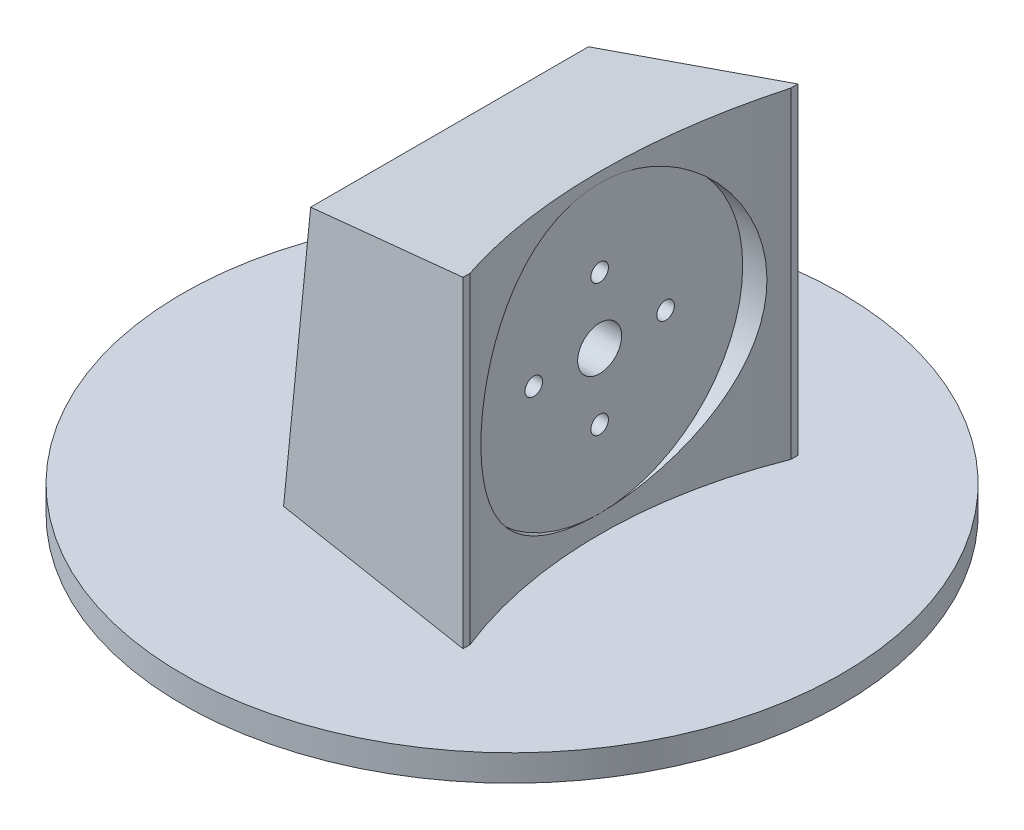
ISO-10303-21;
HEADER;
FILE_DESCRIPTION(('STEP AP214'),'2;1');
FILE_NAME('part.step','',(''),(''),'','','');
FILE_SCHEMA(('AUTOMOTIVE_DESIGN { 1 0 10303 214 1 1 1 1 }'));
ENDSEC;
DATA;
#1=APPLICATION_CONTEXT('core data for automotive mechanical design processes');
#2=APPLICATION_PROTOCOL_DEFINITION('international standard','automotive_design',2000,#1);
#3=PRODUCT_CONTEXT('',#1,'mechanical');
#4=PRODUCT('Part','Part','',(#3));
#5=PRODUCT_RELATED_PRODUCT_CATEGORY('part','',(#4));
#6=PRODUCT_DEFINITION_FORMATION('','',#4);
#7=PRODUCT_DEFINITION_CONTEXT('part definition',#1,'design');
#8=PRODUCT_DEFINITION('design','',#6,#7);
#9=PRODUCT_DEFINITION_SHAPE('','',#8);
#10=(LENGTH_UNIT() NAMED_UNIT(*) SI_UNIT(.MILLI.,.METRE.));
#11=(NAMED_UNIT(*) PLANE_ANGLE_UNIT() SI_UNIT($,.RADIAN.));
#12=(NAMED_UNIT(*) SI_UNIT($,.STERADIAN.) SOLID_ANGLE_UNIT());
#13=UNCERTAINTY_MEASURE_WITH_UNIT(LENGTH_MEASURE(1.E-05),#10,'distance_accuracy_value','');
#14=(GEOMETRIC_REPRESENTATION_CONTEXT(3) GLOBAL_UNCERTAINTY_ASSIGNED_CONTEXT((#13)) GLOBAL_UNIT_ASSIGNED_CONTEXT((#10,
#11,#12)) REPRESENTATION_CONTEXT('',''));
#15=CARTESIAN_POINT('',(0.,0.,0.));
#16=DIRECTION('',(0.,0.,1.));
#17=DIRECTION('',(1.,0.,0.));
#18=AXIS2_PLACEMENT_3D('',#15,#16,#17);
#19=CARTESIAN_POINT('',(91.660714285715,-203.2001,36.5));
#20=DIRECTION('',(0.,1.,0.));
#21=DIRECTION('',(0.,0.,1.));
#22=AXIS2_PLACEMENT_3D('',#19,#20,#21);
#23=CYLINDRICAL_SURFACE('',#22,98.6607142857149);
#24=CARTESIAN_POINT('',(-6.99999999999999,-4.,36.5));
#25=CARTESIAN_POINT('',(-7.00000006938635,-3.99999988021924,37.3885372763786));
#26=CARTESIAN_POINT('',(-6.98796916728867,-4.03641166688261,38.2770731243075));
#27=CARTESIAN_POINT('',(-6.94017665120284,-4.18170778442212,40.0475467179747));
#28=CARTESIAN_POINT('',(-6.90441509210006,-4.29059194768076,40.9294844789686));
#29=CARTESIAN_POINT('',(-6.81013401994207,-4.57981730238695,42.6804011063346));
#30=CARTESIAN_POINT('',(-6.75161231484944,-4.76016537657967,43.5493787161373));
#31=CARTESIAN_POINT('',(-6.61339151059254,-5.19067377754969,45.2681269172679));
#32=CARTESIAN_POINT('',(-6.53369229967722,-5.44083447271981,46.1178974072164));
#33=CARTESIAN_POINT('',(-6.35538689942692,-6.00831649424095,47.7910197245726));
#34=CARTESIAN_POINT('',(-6.25681293658866,-6.3255234412458,48.6144138290591));
#35=CARTESIAN_POINT('',(-6.04323760995826,-7.02477430984269,50.2309548308459));
#36=CARTESIAN_POINT('',(-5.92823628674055,-7.40681807129277,51.0241018028483));
#37=CARTESIAN_POINT('',(-5.68473032060791,-8.23291522228557,52.5753712330099));
#38=CARTESIAN_POINT('',(-5.55622378098862,-8.67697732471825,53.3334887499679));
#39=CARTESIAN_POINT('',(-5.28895986192748,-9.62396132088679,54.8101148597935));
#40=CARTESIAN_POINT('',(-5.15020223069056,-10.1268846605943,55.5286224789754));
#41=CARTESIAN_POINT('',(-4.86154233675666,-11.2045930036212,56.943276576482));
#42=CARTESIAN_POINT('',(-4.71142881699281,-11.7811085162714,57.6380620450445));
#43=CARTESIAN_POINT('',(-4.40797107281053,-12.9894358136026,58.9770008877423));
#44=CARTESIAN_POINT('',(-4.25462678882266,-13.6212486185444,59.6211533272584));
#45=CARTESIAN_POINT('',(-3.94876760978647,-14.9363935608699,60.855033965067));
#46=CARTESIAN_POINT('',(-3.79625288853813,-15.6197360797441,61.4447511429886));
#47=CARTESIAN_POINT('',(-3.49622008892867,-17.0337153626949,62.5659017618829));
#48=CARTESIAN_POINT('',(-3.34870207490673,-17.7643527354028,63.0973344525629));
#49=CARTESIAN_POINT('',(-3.05874172449786,-19.2897146308595,64.1124560176935));
#50=CARTESIAN_POINT('',(-2.9165589125235,-20.0856637999152,64.5943812501675));
#51=CARTESIAN_POINT('',(-2.64613309465236,-21.7177735571122,65.4891992851661));
#52=CARTESIAN_POINT('',(-2.51789041666039,-22.5539350904761,65.90209046397));
#53=CARTESIAN_POINT('',(-2.27942533600008,-24.2605975802209,66.6553121602869));
#54=CARTESIAN_POINT('',(-2.16919874261325,-25.1310904921396,66.995659557814));
#55=CARTESIAN_POINT('',(-1.97035650988741,-26.9003480300949,67.6008153191402));
#56=CARTESIAN_POINT('',(-1.88173992006956,-27.7991114107399,67.8656270053345));
#57=CARTESIAN_POINT('',(-1.73166110486565,-29.5879880627678,68.3096507335954));
#58=CARTESIAN_POINT('',(-1.66939715937794,-30.4774029589521,68.4914059931063));
#59=CARTESIAN_POINT('',(-1.56993894692241,-32.2696871298859,68.7801060194065));
#60=CARTESIAN_POINT('',(-1.53274416895791,-33.1725561300106,68.887052311064));
#61=CARTESIAN_POINT('',(-1.48468113630638,-34.9845408087524,69.0250244495596));
#62=CARTESIAN_POINT('',(-1.47380601462477,-35.8936547959148,69.0560700994626));
#63=CARTESIAN_POINT('',(-1.47873315448031,-37.7112058087644,69.0419722349493));
#64=CARTESIAN_POINT('',(-1.49453468320716,-38.6196428523617,68.9968308133995));
#65=CARTESIAN_POINT('',(-1.55097999230656,-40.3882309114107,68.8345556278875));
#66=CARTESIAN_POINT('',(-1.59048129533918,-41.248724601409,68.7207314381855));
#67=CARTESIAN_POINT('',(-1.69211813588085,-42.9565486195996,68.4250627083349));
#68=CARTESIAN_POINT('',(-1.7542528986177,-43.8038793973401,68.2432204965242));
#69=CARTESIAN_POINT('',(-1.89930586168877,-45.4797454825751,67.8131057979265));
#70=CARTESIAN_POINT('',(-1.98222574579713,-46.3082792614178,67.5648279291681));
#71=CARTESIAN_POINT('',(-2.1664339208442,-47.9411370546915,67.0039319210661));
#72=CARTESIAN_POINT('',(-2.26772269070303,-48.7454604372628,66.6913121041477));
#73=CARTESIAN_POINT('',(-2.48757491815505,-50.3375899400879,65.9986474572427));
#74=CARTESIAN_POINT('',(-2.60638640132822,-51.1249331894082,65.6176138364385));
#75=CARTESIAN_POINT('',(-2.79409945436385,-52.2796628163326,65.0003660731267));
#76=CARTESIAN_POINT('',(-2.85825645934174,-52.6602096754761,64.7869891144184));
#77=CARTESIAN_POINT('',(-2.98932264875029,-53.4121619858722,64.3452895408006));
#78=CARTESIAN_POINT('',(-3.05623243569593,-53.7835654071158,64.1169636474072));
#79=CARTESIAN_POINT('',(-3.26041412562294,-54.883172808634,63.4101561037206));
#80=CARTESIAN_POINT('',(-3.4011483643794,-55.5968347973896,62.9098120275704));
#81=CARTESIAN_POINT('',(-3.68814121871646,-56.9810756666464,61.8541192894888));
#82=CARTESIAN_POINT('',(-3.83440002533978,-57.6516530550876,61.2987687243221));
#83=CARTESIAN_POINT('',(-4.05889110321089,-58.638879305576,60.4121941531234));
#84=CARTESIAN_POINT('',(-4.13648834345508,-58.972552770667,60.0995884281701));
#85=CARTESIAN_POINT('',(-4.29162726248705,-59.626365005127,59.4606787664354));
#86=CARTESIAN_POINT('',(-4.36916895003063,-59.9465069256565,59.1343780545456));
#87=CARTESIAN_POINT('',(-4.60095541029194,-60.8860530859771,58.135491414433));
#88=CARTESIAN_POINT('',(-4.75437173321152,-61.4846218971867,57.4428813051275));
#89=CARTESIAN_POINT('',(-5.05473361071183,-62.6219164771072,56.008855902778));
#90=CARTESIAN_POINT('',(-5.20167850291606,-63.1606361285731,55.2674356331082));
#91=CARTESIAN_POINT('',(-5.48509843468752,-64.1744782472974,53.7403741952948));
#92=CARTESIAN_POINT('',(-5.62157354974552,-64.649601173129,52.954733346068));
#93=CARTESIAN_POINT('',(-5.88153981188521,-65.5368769484307,51.3365448851173));
#94=CARTESIAN_POINT('',(-6.00489365095648,-65.948381108045,50.5036192011035));
#95=CARTESIAN_POINT('',(-6.23359386490435,-66.6994535007599,48.8035165875243));
#96=CARTESIAN_POINT('',(-6.33894001624403,-67.0390208408913,47.9363392329431));
#97=CARTESIAN_POINT('',(-6.52854641064324,-67.6430722927355,46.1742222318911));
#98=CARTESIAN_POINT('',(-6.61281246721029,-67.9075771080408,45.2792903163174));
#99=CARTESIAN_POINT('',(-6.75780776456789,-68.3590746072722,43.4682209501035));
#100=CARTESIAN_POINT('',(-6.81853806425131,-68.5460707784017,42.5520844554403));
#101=CARTESIAN_POINT('',(-6.91260119712613,-68.8343955865342,40.7451589823643));
#102=CARTESIAN_POINT('',(-6.94699053535751,-68.9390330015753,39.8549517810904));
#103=CARTESIAN_POINT('',(-6.99158021256407,-69.0745338238442,38.0683440667751));
#104=CARTESIAN_POINT('',(-7.00178123890712,-69.1053993274747,37.1719437304524));
#105=CARTESIAN_POINT('',(-6.9977097128631,-69.0930577050398,35.3798465019674));
#106=CARTESIAN_POINT('',(-6.98344076748059,-69.0498614960666,34.4841495255966));
#107=CARTESIAN_POINT('',(-6.93083480777777,-68.8898394345348,32.7000802562324));
#108=CARTESIAN_POINT('',(-6.8924980280921,-68.7730142997763,31.8117078919178));
#109=CARTESIAN_POINT('',(-6.79423645561106,-68.4711994586813,30.0738654772518));
#110=CARTESIAN_POINT('',(-6.73495390800708,-68.288234265034,29.224006268323));
#111=CARTESIAN_POINT('',(-6.59621152878559,-67.8554534181377,27.5432045903623));
#112=CARTESIAN_POINT('',(-6.51675218269506,-67.6056393735069,26.7122616666602));
#113=CARTESIAN_POINT('',(-6.3396712304458,-67.0411999885723,25.0746158716635));
#114=CARTESIAN_POINT('',(-6.24204806162277,-66.7265690717138,24.2679150929026));
#115=CARTESIAN_POINT('',(-6.03109361619502,-66.0349741325519,22.6838553608445));
#116=CARTESIAN_POINT('',(-5.91776190224279,-65.6580083747043,21.9064972252538));
#117=CARTESIAN_POINT('',(-5.6750445034493,-64.8338283540359,20.3658675341615));
#118=CARTESIAN_POINT('',(-5.54531817081558,-64.3850431727435,19.6034869558279));
#119=CARTESIAN_POINT('',(-5.34305673005682,-63.6673403475718,18.4903516336136));
#120=CARTESIAN_POINT('',(-5.27435379946857,-63.4206711666397,18.1243607740445));
#121=CARTESIAN_POINT('',(-5.13480192892662,-62.9128062671061,17.4028907237109));
#122=CARTESIAN_POINT('',(-5.06395250727708,-62.6516072766965,17.0474139283209));
#123=CARTESIAN_POINT('',(-4.84886293631561,-61.8468729717835,15.9976058436562));
#124=CARTESIAN_POINT('',(-4.70207337295436,-61.2821718289302,15.31985268804));
#125=CARTESIAN_POINT('',(-4.4054574693996,-60.1000013569676,14.0127481170339));
#126=CARTESIAN_POINT('',(-4.25563105215844,-59.482530687768,13.3833979316167));
#127=CARTESIAN_POINT('',(-4.02817040500257,-58.5052948612115,12.465038558412));
#128=CARTESIAN_POINT('',(-3.95023063751204,-58.1632853098455,12.1570302371489));
#129=CARTESIAN_POINT('',(-3.79513329794573,-57.4665045484266,11.5557810155459));
#130=CARTESIAN_POINT('',(-3.71797554525475,-57.111736375381,11.2625366402262));
#131=CARTESIAN_POINT('',(-3.48845375478196,-56.0289003782251,10.4055146073962));
#132=CARTESIAN_POINT('',(-3.33803030963804,-55.2822548549188,9.86440460906265));
#133=CARTESIAN_POINT('',(-3.04680778471545,-53.7444961617453,8.84675158852445));
#134=CARTESIAN_POINT('',(-2.90600900850904,-52.95338159071,8.37021060242965));
#135=CARTESIAN_POINT('',(-2.63823733238804,-51.3316626872409,7.48520948496329));
#136=CARTESIAN_POINT('',(-2.51126419221074,-50.501059041411,7.07674817043365));
#137=CARTESIAN_POINT('',(-2.27537744571331,-48.8079071514655,6.33214430706681));
#138=CARTESIAN_POINT('',(-2.16642233571994,-47.9454380818967,5.99583501230236));
#139=CARTESIAN_POINT('',(-1.96972394302317,-46.1927699028265,5.39731630355124));
#140=CARTESIAN_POINT('',(-1.88198072463595,-45.3025707092543,5.13510711424168));
#141=CARTESIAN_POINT('',(-1.73067224333006,-43.501399097928,4.68740217565629));
#142=CARTESIAN_POINT('',(-1.66709810661102,-42.5904344347847,4.5018782688045));
#143=CARTESIAN_POINT('',(-1.56628042912651,-40.7545585492031,4.20931929430625));
#144=CARTESIAN_POINT('',(-1.52903559780061,-39.8296480126074,4.10228037962031));
#145=CARTESIAN_POINT('',(-1.48336211419073,-38.0201739597151,3.97121209209996));
#146=CARTESIAN_POINT('',(-1.47357600679801,-37.1359257994844,3.94327171953421));
#147=CARTESIAN_POINT('',(-1.47923210726148,-35.3681889321181,3.95945552076158));
#148=CARTESIAN_POINT('',(-1.49467342655211,-34.4847001993303,4.00357715637195));
#149=CARTESIAN_POINT('',(-1.55028672953893,-32.725081310718,4.16344260873036));
#150=CARTESIAN_POINT('',(-1.59045722021381,-31.8489507138835,4.27918210155946));
#151=CARTESIAN_POINT('',(-1.69425391713303,-30.1103489722141,4.58116716259673));
#152=CARTESIAN_POINT('',(-1.75788020320498,-29.2478778738773,4.76741297076062));
#153=CARTESIAN_POINT('',(-1.90525309709722,-27.5582447651126,5.20465815934755));
#154=CARTESIAN_POINT('',(-1.988610510916,-26.7307254841264,5.45441118401029));
#155=CARTESIAN_POINT('',(-2.17360852817507,-25.1000021292595,6.01813110690589));
#156=CARTESIAN_POINT('',(-2.27524880454255,-24.2967976206979,6.33209685641354));
#157=CARTESIAN_POINT('',(-2.49398869561496,-22.7194432592458,7.02188475019655));
#158=CARTESIAN_POINT('',(-2.61109088194527,-21.9452982671026,7.39771718671229));
#159=CARTESIAN_POINT('',(-2.85757822601426,-20.4306914423535,8.20850970436679));
#160=CARTESIAN_POINT('',(-2.98696382129011,-19.6902308109811,8.64347189195617));
#161=CARTESIAN_POINT('',(-3.26041750687362,-18.2160420205345,9.58963208190045));
#162=CARTESIAN_POINT('',(-3.40487736389312,-17.4839656361855,10.1033002029974));
#163=CARTESIAN_POINT('',(-3.6258291609834,-16.4201266890071,10.916994163656));
#164=CARTESIAN_POINT('',(-3.7001944304754,-16.0712075091097,11.1954411179281));
#165=CARTESIAN_POINT('',(-3.84987734772482,-15.3851438486486,11.7664081592043));
#166=CARTESIAN_POINT('',(-3.92519521566213,-15.0480021606263,12.0589315452788));
#167=CARTESIAN_POINT('',(-4.15181299150519,-14.0550749286328,12.9569073233005));
#168=CARTESIAN_POINT('',(-4.30378689273426,-13.4177404291299,13.5828011340082));
#169=CARTESIAN_POINT('',(-4.60548481423115,-12.1964095099643,14.8851425021411));
#170=CARTESIAN_POINT('',(-4.75520881764884,-11.6124134896028,15.5615904379545));
#171=CARTESIAN_POINT('',(-4.97795892140497,-10.7686807505849,16.6243565255697));
#172=CARTESIAN_POINT('',(-5.05324682558714,-10.4880524972123,16.9937791723638));
#173=CARTESIAN_POINT('',(-5.2016267863963,-9.94270986311723,17.7444722207686));
#174=CARTESIAN_POINT('',(-5.27471936109133,-9.67799171282775,18.1257397832416));
#175=CARTESIAN_POINT('',(-5.48997143429848,-8.90828116509444,19.2866397029895));
#176=CARTESIAN_POINT('',(-5.6281163049021,-8.42769133893212,20.0834213449));
#177=CARTESIAN_POINT('',(-5.88967186784149,-7.53576861896884,21.7168063491419));
#178=CARTESIAN_POINT('',(-6.01308584303076,-7.12442028594169,22.5534007806493));
#179=CARTESIAN_POINT('',(-6.24170141139997,-6.37423725198776,24.2609165521429));
#180=CARTESIAN_POINT('',(-6.34690403754347,-6.03539843800027,25.1318359417452));
#181=CARTESIAN_POINT('',(-6.53116694591902,-5.44879458043133,26.8561525673258));
#182=CARTESIAN_POINT('',(-6.61129294011374,-5.19724377621841,27.708149805564));
#183=CARTESIAN_POINT('',(-6.75026044407504,-4.76434305494516,29.4314976595926));
#184=CARTESIAN_POINT('',(-6.80910277770205,-4.58299042059376,30.302847524884));
#185=CARTESIAN_POINT('',(-6.90389549609838,-4.29217646529803,32.0585054030479));
#186=CARTESIAN_POINT('',(-6.9398509040999,-4.18269936891412,32.9428105288757));
#187=CARTESIAN_POINT('',(-6.98790317798278,-4.03661102309193,34.7180775607991));
#188=CARTESIAN_POINT('',(-6.9999999304244,-4.00000012010744,35.6090394985254));
#189=CARTESIAN_POINT('',(-6.99999999999999,-4.,36.5));
#190=B_SPLINE_CURVE_WITH_KNOTS('',3,(#24,#25,#26,#27,#28,#29,#30,#31,#32,#33,#34,#35,#36,#37,
#38,#39,#40,#41,#42,#43,#44,#45,#46,#47,#48,#49,#50,#51,#52,#53,#54,#55,#56,#57,#58,#59,#60,#61,
#62,#63,#64,#65,#66,#67,#68,#69,#70,#71,#72,#73,#74,#75,#76,#77,#78,#79,#80,#81,#82,#83,#84,#85,
#86,#87,#88,#89,#90,#91,#92,#93,#94,#95,#96,#97,#98,#99,#100,#101,#102,#103,#104,#105,#106,#107,
#108,#109,#110,#111,#112,#113,#114,#115,#116,#117,#118,#119,#120,#121,#122,#123,#124,#125,#126,
#127,#128,#129,#130,#131,#132,#133,#134,#135,#136,#137,#138,#139,#140,#141,#142,#143,#144,#145,
#146,#147,#148,#149,#150,#151,#152,#153,#154,#155,#156,#157,#158,#159,#160,#161,#162,#163,#164,
#165,#166,#167,#168,#169,#170,#171,#172,#173,#174,#175,#176,#177,#178,#179,#180,#181,#182,#183,
#184,#185,#186,#187,#188,#189),.UNSPECIFIED.,.T.,.F.,(4,2,2,2,2,2,2,2,2,2,2,2,2,2,2,2,2,2,2,2,2,
2,2,2,2,2,2,2,2,2,2,2,2,2,2,2,2,2,2,2,2,2,2,2,2,2,2,2,2,2,2,2,2,2,2,2,2,2,2,2,2,2,2,2,2,2,2,2,2,
2,2,2,2,2,2,2,2,2,2,2,2,2,4),(0.,2.66478598896283,5.32956581470613,7.99460234988263,
10.6596529484029,13.3201932082655,15.9807268968932,18.6416347377303,21.3026079595429,
24.0451663976942,26.7877754479947,29.5309385248892,32.2741369102067,35.0945045535153,
37.9149385241692,40.7347154975727,43.5543684255566,46.280690860044,49.0069577209325,
51.7325132017484,54.4579938124977,57.0615981230231,59.6651133172248,62.268839486814,
64.8726335514366,67.5176362580745,68.8402661937596,70.1631871763424,72.808820493765,
75.4545453826127,76.8454941067395,78.236117108444,81.0171829618584,83.7985328099009,
86.5798626015439,89.3879081969201,92.1959886472051,95.0032938240161,97.8104726832143,
100.498118282683,103.185687505454,105.872860600215,108.560007498432,111.171040179704,
113.78201003601,116.393204622405,119.004471922659,121.68359537355,123.023297222177,
124.363301974415,127.043152403427,129.7230709079,131.123144165592,132.522886333506,
135.322178224198,138.12155836682,140.920889853882,143.713680582999,146.506479779979,
149.298252594065,152.089888556787,154.740856418418,157.391730909131,160.04244536925,
162.693168850686,165.295421370138,167.897627341004,170.500266657313,173.102998714897,
175.817395404968,177.174747605651,178.532419491045,181.2475846255,183.962770084494,
185.372371144095,186.781636900762,189.599966952013,192.417667747036,195.235208667212,
197.907939635198,200.58056713447,203.252607841876,205.92466125389),.UNSPECIFIED.);
#191=CARTESIAN_POINT('',(-6.99999999999999,-69.1,36.5));
#192=VERTEX_POINT('',#191);
#193=CARTESIAN_POINT('',(-6.99999999999999,-4.,36.5));
#194=VERTEX_POINT('',#193);
#195=EDGE_CURVE('E276',#192,#194,#190,.T.);
#196=ORIENTED_EDGE('',*,*,#195,.F.);
#197=EDGE_CURVE('E357',#194,#192,#190,.T.);
#198=ORIENTED_EDGE('',*,*,#197,.F.);
#199=EDGE_LOOP('',(#196,#198));
#200=FACE_BOUND('',#199,.T.);
#201=CARTESIAN_POINT('',(91.660714285715,-73.2,36.5));
#202=DIRECTION('',(0.,-1.,0.));
#203=DIRECTION('',(0.,0.,-1.));
#204=AXIS2_PLACEMENT_3D('',#201,#202,#203);
#205=CIRCLE('',#204,98.6607142857149);
#206=CARTESIAN_POINT('',(0.,-73.2,0.));
#207=VERTEX_POINT('',#206);
#208=CARTESIAN_POINT('',(0.,-73.2,73.));
#209=VERTEX_POINT('',#208);
#210=EDGE_CURVE('E177',#207,#209,#205,.F.);
#211=ORIENTED_EDGE('',*,*,#210,.F.);
#212=DIRECTION('',(0.,1.,0.));
#213=VECTOR('',#212,1.);
#214=CARTESIAN_POINT('',(0.,-203.2001,0.));
#215=LINE('',#214,#213);
#216=CARTESIAN_POINT('',(0.,0.,0.));
#217=VERTEX_POINT('',#216);
#218=EDGE_CURVE('E183',#207,#217,#215,.T.);
#219=ORIENTED_EDGE('',*,*,#218,.T.);
#220=CARTESIAN_POINT('',(91.660714285715,22.2712628755916,36.5));
#221=DIRECTION('',(-0.236105481445946,0.971727431758093,0.));
#222=DIRECTION('',(0.971727431758093,0.236105481445946,0.));
#223=AXIS2_PLACEMENT_3D('',#220,#221,#222);
#224=ELLIPSE('',#223,101.53126387223,98.6607142857149);
#225=CARTESIAN_POINT('',(0.,0.,73.));
#226=VERTEX_POINT('',#225);
#227=EDGE_CURVE('E179',#226,#217,#224,.F.);
#228=ORIENTED_EDGE('',*,*,#227,.F.);
#229=DIRECTION('',(0.,1.,0.));
#230=VECTOR('',#229,1.);
#231=CARTESIAN_POINT('',(0.,-203.2001,73.));
#232=LINE('',#231,#230);
#233=EDGE_CURVE('E175',#209,#226,#232,.T.);
#234=ORIENTED_EDGE('',*,*,#233,.F.);
#235=EDGE_LOOP('',(#211,#219,#228,#234));
#236=FACE_BOUND('',#235,.T.);
#237=ADVANCED_FACE('F98',(#200,#236),#23,.F.);
#238=CARTESIAN_POINT('',(-63.5,-203.2,-1.59999999999998));
#239=DIRECTION('',(-0.993378927542283,0.114883881876199,0.));
#240=DIRECTION('',(0.,0.,1.));
#241=AXIS2_PLACEMENT_3D('',#238,#239,#240);
#242=PLANE('',#241);
#243=CARTESIAN_POINT('',(-44.2269931102362,-36.5499999999998,21.4999999999998));
#244=DIRECTION('',(-0.993378927542283,0.114883881876199,0.));
#245=DIRECTION('',(0.114883881876199,0.993378927542283,0.));
#246=AXIS2_PLACEMENT_3D('',#243,#244,#245);
#247=ELLIPSE('',#246,3.07032886991674,3.05);
#248=CARTESIAN_POINT('',(-43.8742618110236,-33.4999999999998,21.4999999999998));
#249=VERTEX_POINT('',#248);
#250=EDGE_CURVE('E390',#249,#249,#247,.T.);
#251=ORIENTED_EDGE('',*,*,#250,.F.);
#252=EDGE_LOOP('',(#251));
#253=FACE_BOUND('',#252,.T.);
#254=CARTESIAN_POINT('',(-45.9617372047244,-51.55,36.4999999999997));
#255=DIRECTION('',(-0.993378927542283,0.114883881876199,0.));
#256=DIRECTION('',(0.114883881876199,0.993378927542283,0.));
#257=AXIS2_PLACEMENT_3D('',#254,#255,#256);
#258=ELLIPSE('',#257,3.07032886991674,3.05);
#259=CARTESIAN_POINT('',(-45.6090059055118,-48.5,36.4999999999997));
#260=VERTEX_POINT('',#259);
#261=EDGE_CURVE('E387',#260,#260,#258,.T.);
#262=ORIENTED_EDGE('',*,*,#261,.F.);
#263=EDGE_LOOP('',(#262));
#264=FACE_BOUND('',#263,.T.);
#265=CARTESIAN_POINT('',(-44.2269931102362,-36.5500000000001,51.4999999999998));
#266=DIRECTION('',(-0.993378927542283,0.114883881876199,0.));
#267=DIRECTION('',(0.114883881876199,0.993378927542283,0.));
#268=AXIS2_PLACEMENT_3D('',#265,#266,#267);
#269=ELLIPSE('',#268,3.07032886991675,3.05000000000001);
#270=CARTESIAN_POINT('',(-43.8742618110236,-33.5,51.4999999999998));
#271=VERTEX_POINT('',#270);
#272=EDGE_CURVE('E384',#271,#271,#269,.T.);
#273=ORIENTED_EDGE('',*,*,#272,.F.);
#274=EDGE_LOOP('',(#273));
#275=FACE_BOUND('',#274,.T.);
#276=CARTESIAN_POINT('',(-42.492249015748,-21.55,36.5));
#277=DIRECTION('',(-0.993378927542283,0.114883881876199,0.));
#278=DIRECTION('',(0.114883881876199,0.993378927542283,0.));
#279=AXIS2_PLACEMENT_3D('',#276,#277,#278);
#280=ELLIPSE('',#279,3.07032886991674,3.05);
#281=CARTESIAN_POINT('',(-42.1395177165354,-18.5,36.5));
#282=VERTEX_POINT('',#281);
#283=EDGE_CURVE('E270',#282,#282,#280,.T.);
#284=ORIENTED_EDGE('',*,*,#283,.F.);
#285=EDGE_LOOP('',(#284));
#286=FACE_BOUND('',#285,.T.);
#287=DIRECTION('',(-0.114883881876199,-0.993378927542283,0.));
#288=VECTOR('',#287,1.);
#289=CARTESIAN_POINT('',(-63.5,-203.2,25.));
#290=LINE('',#289,#288);
#291=CARTESIAN_POINT('',(-42.8970226377953,-25.05,25.));
#292=VERTEX_POINT('',#291);
#293=CARTESIAN_POINT('',(-45.5569635826772,-48.05,25.));
#294=VERTEX_POINT('',#293);
#295=EDGE_CURVE('E292',#292,#294,#290,.T.);
#296=ORIENTED_EDGE('',*,*,#295,.F.);
#297=DIRECTION('',(0.,0.,1.));
#298=VECTOR('',#297,1.);
#299=CARTESIAN_POINT('',(-42.8970226377953,-25.05,25.));
#300=LINE('',#299,#298);
#301=CARTESIAN_POINT('',(-42.8970226377953,-25.0500000000001,48.));
#302=VERTEX_POINT('',#301);
#303=EDGE_CURVE('E236',#292,#302,#300,.T.);
#304=ORIENTED_EDGE('',*,*,#303,.T.);
#305=DIRECTION('',(-0.114883881876199,-0.993378927542283,0.));
#306=VECTOR('',#305,1.);
#307=CARTESIAN_POINT('',(-63.5,-203.2,48.));
#308=LINE('',#307,#306);
#309=CARTESIAN_POINT('',(-45.5569635826771,-48.05,48.));
#310=VERTEX_POINT('',#309);
#311=EDGE_CURVE('E303',#302,#310,#308,.T.);
#312=ORIENTED_EDGE('',*,*,#311,.T.);
#313=DIRECTION('',(0.,0.,-1.));
#314=VECTOR('',#313,1.);
#315=CARTESIAN_POINT('',(-45.5569635826772,-48.05,-1.59999999999998));
#316=LINE('',#315,#314);
#317=EDGE_CURVE('E297',#310,#294,#316,.T.);
#318=ORIENTED_EDGE('',*,*,#317,.T.);
#319=EDGE_LOOP('',(#296,#304,#312,#318));
#320=FACE_BOUND('',#319,.T.);
#321=DIRECTION('',(0.114865054896776,0.993216134256375,-0.0181033095422482));
#322=VECTOR('',#321,1.);
#323=CARTESIAN_POINT('',(-63.4791891566597,-203.020052622692,8.40463902469429));
#324=LINE('',#323,#322);
#325=CARTESIAN_POINT('',(-48.4655511811024,-73.2,6.03841427626215));
#326=VERTEX_POINT('',#325);
#327=CARTESIAN_POINT('',(-41.1564960629921,-10.,4.88647048114176));
#328=VERTEX_POINT('',#327);
#329=EDGE_CURVE('E213',#326,#328,#324,.T.);
#330=ORIENTED_EDGE('',*,*,#329,.F.);
#331=DIRECTION('',(0.,0.,1.));
#332=VECTOR('',#331,1.);
#333=CARTESIAN_POINT('',(-48.4655511811024,-73.2,-1.59999999999998));
#334=LINE('',#333,#332);
#335=CARTESIAN_POINT('',(-48.4655511811023,-73.2,66.9615857276835));
#336=VERTEX_POINT('',#335);
#337=EDGE_CURVE('E195',#326,#336,#334,.T.);
#338=ORIENTED_EDGE('',*,*,#337,.T.);
#339=DIRECTION('',(-0.114865054896795,-0.993216134256544,-0.0181033095328998));
#340=VECTOR('',#339,1.);
#341=CARTESIAN_POINT('',(-63.6376423051014,-204.390166655175,64.5703879684878));
#342=LINE('',#341,#340);
#343=CARTESIAN_POINT('',(-41.1564960629921,-9.99999999999998,68.1135295222089));
#344=VERTEX_POINT('',#343);
#345=EDGE_CURVE('E208',#344,#336,#342,.T.);
#346=ORIENTED_EDGE('',*,*,#345,.F.);
#347=DIRECTION('',(0.,0.,1.));
#348=VECTOR('',#347,1.);
#349=CARTESIAN_POINT('',(-41.1564960629921,-10.,-1.6001));
#350=LINE('',#349,#348);
#351=EDGE_CURVE('E197',#328,#344,#350,.T.);
#352=ORIENTED_EDGE('',*,*,#351,.F.);
#353=EDGE_LOOP('',(#330,#338,#346,#352));
#354=FACE_BOUND('',#353,.T.);
#355=ADVANCED_FACE('F316',(#253,#264,#275,#286,#320,#354),#242,.T.);
#356=CARTESIAN_POINT('',(0.,-203.21,74.6));
#357=DIRECTION('',(0.155683346323281,0.,-0.987807013377403));
#358=DIRECTION('',(-0.987807013377403,0.,-0.155683346323281));
#359=AXIS2_PLACEMENT_3D('',#356,#357,#358);
#360=PLANE('',#359);
#361=DIRECTION('',(-0.987807013377403,0.,-0.155683346323281));
#362=VECTOR('',#361,1.);
#363=CARTESIAN_POINT('',(0.,-73.2,74.6));
#364=LINE('',#363,#362);
#365=CARTESIAN_POINT('',(0.,-73.2,74.6));
#366=VERTEX_POINT('',#365);
#367=EDGE_CURVE('E194',#366,#336,#364,.T.);
#368=ORIENTED_EDGE('',*,*,#367,.F.);
#369=DIRECTION('',(0.,1.,0.));
#370=VECTOR('',#369,1.);
#371=CARTESIAN_POINT('',(0.,-203.211,74.6));
#372=LINE('',#371,#370);
#373=CARTESIAN_POINT('',(0.,0.,74.6));
#374=VERTEX_POINT('',#373);
#375=EDGE_CURVE('E188',#366,#374,#372,.T.);
#376=ORIENTED_EDGE('',*,*,#375,.T.);
#377=DIRECTION('',(0.960528289792012,0.233384369826303,0.151384082485619));
#378=VECTOR('',#377,1.);
#379=CARTESIAN_POINT('',(-45.5540509723481,-11.0684959435384,67.4204527828688));
#380=LINE('',#379,#378);
#381=EDGE_CURVE('E204',#344,#374,#380,.T.);
#382=ORIENTED_EDGE('',*,*,#381,.F.);
#383=ORIENTED_EDGE('',*,*,#345,.T.);
#384=EDGE_LOOP('',(#368,#376,#382,#383));
#385=FACE_BOUND('',#384,.T.);
#386=ADVANCED_FACE('F311',(#385),#360,.F.);
#387=CARTESIAN_POINT('',(-63.4497546584067,-203.21,8.39999999993978));
#388=DIRECTION('',(0.155683346401751,0.,0.987807013365036));
#389=DIRECTION('',(0.987807013365036,0.,-0.155683346401751));
#390=AXIS2_PLACEMENT_3D('',#387,#388,#389);
#391=PLANE('',#390);
#392=DIRECTION('',(0.987807013365036,0.,-0.155683346401751));
#393=VECTOR('',#392,1.);
#394=CARTESIAN_POINT('',(-63.4497546584067,-73.2,8.39999999993978));
#395=LINE('',#394,#393);
#396=CARTESIAN_POINT('',(0.,-73.2,-1.6));
#397=VERTEX_POINT('',#396);
#398=EDGE_CURVE('E199',#326,#397,#395,.T.);
#399=ORIENTED_EDGE('',*,*,#398,.F.);
#400=ORIENTED_EDGE('',*,*,#329,.T.);
#401=DIRECTION('',(-0.960528289780641,-0.23338436982354,0.151384082562026));
#402=VECTOR('',#401,1.);
#403=CARTESIAN_POINT('',(-105.547807637262,-25.6454795072243,15.0348645798337));
#404=LINE('',#403,#402);
#405=CARTESIAN_POINT('',(0.,0.,-1.6));
#406=VERTEX_POINT('',#405);
#407=EDGE_CURVE('E290',#406,#328,#404,.T.);
#408=ORIENTED_EDGE('',*,*,#407,.F.);
#409=DIRECTION('',(0.,1.,0.));
#410=VECTOR('',#409,1.);
#411=CARTESIAN_POINT('',(0.,-214.12548042261,-1.6));
#412=LINE('',#411,#410);
#413=EDGE_CURVE('E229',#397,#406,#412,.T.);
#414=ORIENTED_EDGE('',*,*,#413,.F.);
#415=EDGE_LOOP('',(#399,#400,#408,#414));
#416=FACE_BOUND('',#415,.T.);
#417=ADVANCED_FACE('F636',(#416),#391,.F.);
#418=CARTESIAN_POINT('',(0.,-203.2,74.6));
#419=DIRECTION('',(1.,0.,0.));
#420=DIRECTION('',(0.,0.,-1.));
#421=AXIS2_PLACEMENT_3D('',#418,#419,#420);
#422=PLANE('',#421);
#423=ORIENTED_EDGE('',*,*,#375,.F.);
#424=DIRECTION('',(0.,0.,-1.));
#425=VECTOR('',#424,1.);
#426=CARTESIAN_POINT('',(0.,-73.2,74.6));
#427=LINE('',#426,#425);
#428=EDGE_CURVE('E13',#366,#209,#427,.T.);
#429=ORIENTED_EDGE('',*,*,#428,.T.);
#430=ORIENTED_EDGE('',*,*,#233,.T.);
#431=DIRECTION('',(0.,0.,-1.));
#432=VECTOR('',#431,1.);
#433=CARTESIAN_POINT('',(0.,0.,74.6));
#434=LINE('',#433,#432);
#435=EDGE_CURVE('E215',#374,#226,#434,.T.);
#436=ORIENTED_EDGE('',*,*,#435,.F.);
#437=EDGE_LOOP('',(#423,#429,#430,#436));
#438=FACE_BOUND('',#437,.T.);
#439=ADVANCED_FACE('F100',(#438),#422,.T.);
#440=ORIENTED_EDGE('',*,*,#218,.F.);
#441=EDGE_CURVE('E102',#207,#397,#427,.T.);
#442=ORIENTED_EDGE('',*,*,#441,.T.);
#443=ORIENTED_EDGE('',*,*,#413,.T.);
#444=DIRECTION('',(0.,0.,-1.));
#445=VECTOR('',#444,1.);
#446=CARTESIAN_POINT('',(0.,0.,0.));
#447=LINE('',#446,#445);
#448=EDGE_CURVE('E279',#217,#406,#447,.T.);
#449=ORIENTED_EDGE('',*,*,#448,.F.);
#450=EDGE_LOOP('',(#440,#442,#443,#449));
#451=FACE_BOUND('',#450,.T.);
#452=ADVANCED_FACE('F370',(#451),#422,.T.);
#453=CARTESIAN_POINT('',(-6.99999999999999,-36.55,36.5));
#454=DIRECTION('',(1.,0.,0.));
#455=DIRECTION('',(0.,0.,-1.));
#456=AXIS2_PLACEMENT_3D('',#453,#454,#455);
#457=PLANE('',#456);
#458=CARTESIAN_POINT('',(-6.99999999999999,-36.55,36.5));
#459=DIRECTION('',(1.,0.,0.));
#460=DIRECTION('',(0.,0.,-1.));
#461=AXIS2_PLACEMENT_3D('',#458,#459,#460);
#462=CIRCLE('',#461,5.);
#463=CARTESIAN_POINT('',(-6.99999999999999,-36.55,31.5));
#464=VERTEX_POINT('',#463);
#465=EDGE_CURVE('E219',#464,#464,#462,.T.);
#466=ORIENTED_EDGE('',*,*,#465,.F.);
#467=EDGE_LOOP('',(#466));
#468=FACE_BOUND('',#467,.T.);
#469=CARTESIAN_POINT('',(-6.99999999999999,-21.55,36.5));
#470=DIRECTION('',(1.,0.,0.));
#471=DIRECTION('',(0.,0.,-1.));
#472=AXIS2_PLACEMENT_3D('',#469,#470,#471);
#473=CIRCLE('',#472,2.);
#474=CARTESIAN_POINT('',(-6.99999999999999,-21.55,34.5));
#475=VERTEX_POINT('',#474);
#476=EDGE_CURVE('E184',#475,#475,#473,.T.);
#477=ORIENTED_EDGE('',*,*,#476,.F.);
#478=EDGE_LOOP('',(#477));
#479=FACE_BOUND('',#478,.T.);
#480=CARTESIAN_POINT('',(-7.,-36.5499999999998,21.4999999999998));
#481=DIRECTION('',(1.,0.,0.));
#482=DIRECTION('',(0.,0.,-1.));
#483=AXIS2_PLACEMENT_3D('',#480,#481,#482);
#484=CIRCLE('',#483,2.);
#485=CARTESIAN_POINT('',(-7.,-36.5499999999998,19.4999999999998));
#486=VERTEX_POINT('',#485);
#487=EDGE_CURVE('E261',#486,#486,#484,.T.);
#488=ORIENTED_EDGE('',*,*,#487,.F.);
#489=EDGE_LOOP('',(#488));
#490=FACE_BOUND('',#489,.T.);
#491=CARTESIAN_POINT('',(-6.99999999999999,-51.55,36.4999999999997));
#492=DIRECTION('',(1.,0.,0.));
#493=DIRECTION('',(0.,0.,-1.));
#494=AXIS2_PLACEMENT_3D('',#491,#492,#493);
#495=CIRCLE('',#494,2.00000000000001);
#496=CARTESIAN_POINT('',(-6.99999999999999,-51.55,34.4999999999997));
#497=VERTEX_POINT('',#496);
#498=EDGE_CURVE('E264',#497,#497,#495,.T.);
#499=ORIENTED_EDGE('',*,*,#498,.F.);
#500=EDGE_LOOP('',(#499));
#501=FACE_BOUND('',#500,.T.);
#502=CARTESIAN_POINT('',(-6.99999999999999,-36.5500000000001,51.4999999999998));
#503=DIRECTION('',(1.,0.,0.));
#504=DIRECTION('',(0.,0.,-1.));
#505=AXIS2_PLACEMENT_3D('',#502,#503,#504);
#506=CIRCLE('',#505,2.);
#507=CARTESIAN_POINT('',(-6.99999999999999,-36.5500000000001,49.4999999999998));
#508=VERTEX_POINT('',#507);
#509=EDGE_CURVE('E267',#508,#508,#506,.T.);
#510=ORIENTED_EDGE('',*,*,#509,.F.);
#511=EDGE_LOOP('',(#510));
#512=FACE_BOUND('',#511,.T.);
#513=CARTESIAN_POINT('',(-6.99999999999999,-36.55,36.5));
#514=DIRECTION('',(1.,0.,0.));
#515=DIRECTION('',(0.,0.,-1.));
#516=AXIS2_PLACEMENT_3D('',#513,#514,#515);
#517=CIRCLE('',#516,32.55);
#518=EDGE_CURVE('E374',#192,#194,#517,.T.);
#519=ORIENTED_EDGE('',*,*,#518,.T.);
#520=EDGE_CURVE('E358',#194,#192,#517,.T.);
#521=ORIENTED_EDGE('',*,*,#520,.T.);
#522=EDGE_LOOP('',(#519,#521));
#523=FACE_BOUND('',#522,.T.);
#524=ADVANCED_FACE('F350',(#468,#479,#490,#501,#512,#523),#457,.T.);
#525=CARTESIAN_POINT('',(-6.99999999999999,-36.55,36.5));
#526=DIRECTION('',(1.,0.,0.));
#527=DIRECTION('',(0.,0.,-1.));
#528=AXIS2_PLACEMENT_3D('',#525,#526,#527);
#529=CYLINDRICAL_SURFACE('',#528,32.55);
#530=ORIENTED_EDGE('',*,*,#518,.F.);
#531=ORIENTED_EDGE('',*,*,#195,.T.);
#532=EDGE_LOOP('',(#530,#531));
#533=FACE_BOUND('',#532,.T.);
#534=ADVANCED_FACE('F360',(#533),#529,.F.);
#535=ORIENTED_EDGE('',*,*,#520,.F.);
#536=ORIENTED_EDGE('',*,*,#197,.T.);
#537=EDGE_LOOP('',(#535,#536));
#538=FACE_BOUND('',#537,.T.);
#539=ADVANCED_FACE('F363',(#538),#529,.F.);
#540=CARTESIAN_POINT('',(-63.5001,-36.5500000000001,51.4999999999998));
#541=DIRECTION('',(1.,0.,0.));
#542=DIRECTION('',(0.,0.,-1.));
#543=AXIS2_PLACEMENT_3D('',#540,#541,#542);
#544=CYLINDRICAL_SURFACE('',#543,2.);
#545=CARTESIAN_POINT('',(-15.,-36.5500000000001,51.4999999999998));
#546=DIRECTION('',(1.,0.,0.));
#547=DIRECTION('',(0.,0.,-1.));
#548=AXIS2_PLACEMENT_3D('',#545,#546,#547);
#549=CIRCLE('',#548,2.);
#550=CARTESIAN_POINT('',(-15.,-36.5500000000001,49.4999999999998));
#551=VERTEX_POINT('',#550);
#552=EDGE_CURVE('E393',#551,#551,#549,.F.);
#553=ORIENTED_EDGE('',*,*,#552,.T.);
#554=EDGE_LOOP('',(#553));
#555=FACE_BOUND('',#554,.T.);
#556=ORIENTED_EDGE('',*,*,#509,.T.);
#557=EDGE_LOOP('',(#556));
#558=FACE_BOUND('',#557,.T.);
#559=ADVANCED_FACE('F348',(#555,#558),#544,.F.);
#560=CARTESIAN_POINT('',(-63.5001,-51.55,36.4999999999997));
#561=DIRECTION('',(1.,0.,0.));
#562=DIRECTION('',(0.,0.,-1.));
#563=AXIS2_PLACEMENT_3D('',#560,#561,#562);
#564=CYLINDRICAL_SURFACE('',#563,2.00000000000001);
#565=CARTESIAN_POINT('',(-15.,-51.55,36.4999999999997));
#566=DIRECTION('',(1.,0.,0.));
#567=DIRECTION('',(0.,0.,-1.));
#568=AXIS2_PLACEMENT_3D('',#565,#566,#567);
#569=CIRCLE('',#568,2.00000000000001);
#570=CARTESIAN_POINT('',(-15.,-51.55,34.4999999999997));
#571=VERTEX_POINT('',#570);
#572=EDGE_CURVE('E396',#571,#571,#569,.F.);
#573=ORIENTED_EDGE('',*,*,#572,.T.);
#574=EDGE_LOOP('',(#573));
#575=FACE_BOUND('',#574,.T.);
#576=ORIENTED_EDGE('',*,*,#498,.T.);
#577=EDGE_LOOP('',(#576));
#578=FACE_BOUND('',#577,.T.);
#579=ADVANCED_FACE('F450',(#575,#578),#564,.F.);
#580=CARTESIAN_POINT('',(-63.5001,-36.5499999999998,21.4999999999998));
#581=DIRECTION('',(1.,0.,0.));
#582=DIRECTION('',(0.,0.,-1.));
#583=AXIS2_PLACEMENT_3D('',#580,#581,#582);
#584=CYLINDRICAL_SURFACE('',#583,2.);
#585=CARTESIAN_POINT('',(-15.,-36.5499999999998,21.4999999999998));
#586=DIRECTION('',(1.,0.,0.));
#587=DIRECTION('',(0.,0.,-1.));
#588=AXIS2_PLACEMENT_3D('',#585,#586,#587);
#589=CIRCLE('',#588,2.);
#590=CARTESIAN_POINT('',(-15.,-36.5499999999998,19.4999999999998));
#591=VERTEX_POINT('',#590);
#592=EDGE_CURVE('E399',#591,#591,#589,.F.);
#593=ORIENTED_EDGE('',*,*,#592,.T.);
#594=EDGE_LOOP('',(#593));
#595=FACE_BOUND('',#594,.T.);
#596=ORIENTED_EDGE('',*,*,#487,.T.);
#597=EDGE_LOOP('',(#596));
#598=FACE_BOUND('',#597,.T.);
#599=ADVANCED_FACE('F419',(#595,#598),#584,.F.);
#600=CARTESIAN_POINT('',(-63.5001,-21.55,36.5));
#601=DIRECTION('',(1.,0.,0.));
#602=DIRECTION('',(0.,0.,-1.));
#603=AXIS2_PLACEMENT_3D('',#600,#601,#602);
#604=CYLINDRICAL_SURFACE('',#603,2.);
#605=CARTESIAN_POINT('',(-15.,-21.55,36.5));
#606=DIRECTION('',(1.,0.,0.));
#607=DIRECTION('',(0.,0.,-1.));
#608=AXIS2_PLACEMENT_3D('',#605,#606,#607);
#609=CIRCLE('',#608,2.);
#610=CARTESIAN_POINT('',(-15.,-21.55,34.5));
#611=VERTEX_POINT('',#610);
#612=EDGE_CURVE('E250',#611,#611,#609,.F.);
#613=ORIENTED_EDGE('',*,*,#612,.T.);
#614=EDGE_LOOP('',(#613));
#615=FACE_BOUND('',#614,.T.);
#616=ORIENTED_EDGE('',*,*,#476,.T.);
#617=EDGE_LOOP('',(#616));
#618=FACE_BOUND('',#617,.T.);
#619=ADVANCED_FACE('F404',(#615,#618),#604,.F.);
#620=CARTESIAN_POINT('',(-15.,-21.55,36.5));
#621=DIRECTION('',(1.,0.,0.));
#622=DIRECTION('',(0.,0.,-1.));
#623=AXIS2_PLACEMENT_3D('',#620,#621,#622);
#624=PLANE('',#623);
#625=CARTESIAN_POINT('',(-15.,-21.55,36.5));
#626=DIRECTION('',(1.,0.,0.));
#627=DIRECTION('',(0.,0.,-1.));
#628=AXIS2_PLACEMENT_3D('',#625,#626,#627);
#629=CIRCLE('',#628,3.05);
#630=CARTESIAN_POINT('',(-15.,-21.55,33.45));
#631=VERTEX_POINT('',#630);
#632=EDGE_CURVE('E247',#631,#631,#629,.T.);
#633=ORIENTED_EDGE('',*,*,#632,.F.);
#634=EDGE_LOOP('',(#633));
#635=FACE_BOUND('',#634,.T.);
#636=ORIENTED_EDGE('',*,*,#612,.F.);
#637=EDGE_LOOP('',(#636));
#638=FACE_BOUND('',#637,.T.);
#639=ADVANCED_FACE('F407',(#635,#638),#624,.F.);
#640=CARTESIAN_POINT('',(-63.5001,-21.55,36.5));
#641=DIRECTION('',(1.,0.,0.));
#642=DIRECTION('',(0.,0.,-1.));
#643=AXIS2_PLACEMENT_3D('',#640,#641,#642);
#644=CYLINDRICAL_SURFACE('',#643,3.05);
#645=ORIENTED_EDGE('',*,*,#283,.T.);
#646=EDGE_LOOP('',(#645));
#647=FACE_BOUND('',#646,.T.);
#648=ORIENTED_EDGE('',*,*,#632,.T.);
#649=EDGE_LOOP('',(#648));
#650=FACE_BOUND('',#649,.T.);
#651=ADVANCED_FACE('F409',(#647,#650),#644,.F.);
#652=CARTESIAN_POINT('',(-15.,-36.5499999999998,21.4999999999998));
#653=DIRECTION('',(1.,0.,0.));
#654=DIRECTION('',(0.,0.,-1.));
#655=AXIS2_PLACEMENT_3D('',#652,#653,#654);
#656=PLANE('',#655);
#657=CARTESIAN_POINT('',(-15.,-36.5499999999998,21.4999999999998));
#658=DIRECTION('',(1.,0.,0.));
#659=DIRECTION('',(0.,0.,-1.));
#660=AXIS2_PLACEMENT_3D('',#657,#658,#659);
#661=CIRCLE('',#660,3.05);
#662=CARTESIAN_POINT('',(-15.,-36.5499999999998,18.4499999999998));
#663=VERTEX_POINT('',#662);
#664=EDGE_CURVE('E245',#663,#663,#661,.T.);
#665=ORIENTED_EDGE('',*,*,#664,.F.);
#666=EDGE_LOOP('',(#665));
#667=FACE_BOUND('',#666,.T.);
#668=ORIENTED_EDGE('',*,*,#592,.F.);
#669=EDGE_LOOP('',(#668));
#670=FACE_BOUND('',#669,.T.);
#671=ADVANCED_FACE('F416',(#667,#670),#656,.F.);
#672=CARTESIAN_POINT('',(-63.5001,-36.5499999999998,21.4999999999998));
#673=DIRECTION('',(1.,0.,0.));
#674=DIRECTION('',(0.,0.,-1.));
#675=AXIS2_PLACEMENT_3D('',#672,#673,#674);
#676=CYLINDRICAL_SURFACE('',#675,3.05);
#677=ORIENTED_EDGE('',*,*,#250,.T.);
#678=EDGE_LOOP('',(#677));
#679=FACE_BOUND('',#678,.T.);
#680=ORIENTED_EDGE('',*,*,#664,.T.);
#681=EDGE_LOOP('',(#680));
#682=FACE_BOUND('',#681,.T.);
#683=ADVANCED_FACE('F441',(#679,#682),#676,.F.);
#684=CARTESIAN_POINT('',(-15.,-51.55,36.4999999999997));
#685=DIRECTION('',(1.,0.,0.));
#686=DIRECTION('',(0.,0.,-1.));
#687=AXIS2_PLACEMENT_3D('',#684,#685,#686);
#688=PLANE('',#687);
#689=CARTESIAN_POINT('',(-15.,-51.55,36.4999999999997));
#690=DIRECTION('',(1.,0.,0.));
#691=DIRECTION('',(0.,0.,-1.));
#692=AXIS2_PLACEMENT_3D('',#689,#690,#691);
#693=CIRCLE('',#692,3.05);
#694=CARTESIAN_POINT('',(-15.,-51.55,33.4499999999997));
#695=VERTEX_POINT('',#694);
#696=EDGE_CURVE('E254',#695,#695,#693,.T.);
#697=ORIENTED_EDGE('',*,*,#696,.F.);
#698=EDGE_LOOP('',(#697));
#699=FACE_BOUND('',#698,.T.);
#700=ORIENTED_EDGE('',*,*,#572,.F.);
#701=EDGE_LOOP('',(#700));
#702=FACE_BOUND('',#701,.T.);
#703=ADVANCED_FACE('F437',(#699,#702),#688,.F.);
#704=CARTESIAN_POINT('',(-63.5001,-51.55,36.4999999999997));
#705=DIRECTION('',(1.,0.,0.));
#706=DIRECTION('',(0.,0.,-1.));
#707=AXIS2_PLACEMENT_3D('',#704,#705,#706);
#708=CYLINDRICAL_SURFACE('',#707,3.05);
#709=ORIENTED_EDGE('',*,*,#261,.T.);
#710=EDGE_LOOP('',(#709));
#711=FACE_BOUND('',#710,.T.);
#712=ORIENTED_EDGE('',*,*,#696,.T.);
#713=EDGE_LOOP('',(#712));
#714=FACE_BOUND('',#713,.T.);
#715=ADVANCED_FACE('F433',(#711,#714),#708,.F.);
#716=CARTESIAN_POINT('',(-15.,-36.5500000000001,51.4999999999998));
#717=DIRECTION('',(1.,0.,0.));
#718=DIRECTION('',(0.,0.,-1.));
#719=AXIS2_PLACEMENT_3D('',#716,#717,#718);
#720=PLANE('',#719);
#721=CARTESIAN_POINT('',(-15.,-36.5500000000001,51.4999999999998));
#722=DIRECTION('',(1.,0.,0.));
#723=DIRECTION('',(0.,0.,-1.));
#724=AXIS2_PLACEMENT_3D('',#721,#722,#723);
#725=CIRCLE('',#724,3.05000000000001);
#726=CARTESIAN_POINT('',(-15.,-36.5500000000001,48.4499999999998));
#727=VERTEX_POINT('',#726);
#728=EDGE_CURVE('E251',#727,#727,#725,.T.);
#729=ORIENTED_EDGE('',*,*,#728,.F.);
#730=EDGE_LOOP('',(#729));
#731=FACE_BOUND('',#730,.T.);
#732=ORIENTED_EDGE('',*,*,#552,.F.);
#733=EDGE_LOOP('',(#732));
#734=FACE_BOUND('',#733,.T.);
#735=ADVANCED_FACE('F429',(#731,#734),#720,.F.);
#736=CARTESIAN_POINT('',(-63.5001,-36.5500000000001,51.4999999999998));
#737=DIRECTION('',(1.,0.,0.));
#738=DIRECTION('',(0.,0.,-1.));
#739=AXIS2_PLACEMENT_3D('',#736,#737,#738);
#740=CYLINDRICAL_SURFACE('',#739,3.05000000000001);
#741=ORIENTED_EDGE('',*,*,#272,.T.);
#742=EDGE_LOOP('',(#741));
#743=FACE_BOUND('',#742,.T.);
#744=ORIENTED_EDGE('',*,*,#728,.T.);
#745=EDGE_LOOP('',(#744));
#746=FACE_BOUND('',#745,.T.);
#747=ADVANCED_FACE('F426',(#743,#746),#740,.F.);
#748=CARTESIAN_POINT('',(-63.5001,-48.05,25.));
#749=DIRECTION('',(0.,0.,-1.));
#750=DIRECTION('',(-1.,0.,0.));
#751=AXIS2_PLACEMENT_3D('',#748,#749,#750);
#752=PLANE('',#751);
#753=ORIENTED_EDGE('',*,*,#295,.T.);
#754=DIRECTION('',(1.,0.,0.));
#755=VECTOR('',#754,1.);
#756=CARTESIAN_POINT('',(-63.5001,-48.05,25.));
#757=LINE('',#756,#755);
#758=CARTESIAN_POINT('',(-42.8970226377953,-48.05,25.));
#759=VERTEX_POINT('',#758);
#760=EDGE_CURVE('E243',#294,#759,#757,.T.);
#761=ORIENTED_EDGE('',*,*,#760,.T.);
#762=DIRECTION('',(0.,1.,0.));
#763=VECTOR('',#762,1.);
#764=CARTESIAN_POINT('',(-42.8970226377953,-48.05,25.));
#765=LINE('',#764,#763);
#766=EDGE_CURVE('E233',#759,#292,#765,.T.);
#767=ORIENTED_EDGE('',*,*,#766,.T.);
#768=EDGE_LOOP('',(#753,#761,#767));
#769=FACE_BOUND('',#768,.T.);
#770=ADVANCED_FACE('F423',(#769),#752,.F.);
#771=CARTESIAN_POINT('',(-63.5001,-48.05,25.));
#772=DIRECTION('',(0.,1.,0.));
#773=DIRECTION('',(-1.,0.,0.));
#774=AXIS2_PLACEMENT_3D('',#771,#772,#773);
#775=PLANE('',#774);
#776=DIRECTION('',(1.,0.,0.));
#777=VECTOR('',#776,1.);
#778=CARTESIAN_POINT('',(-63.5001,-48.05,48.));
#779=LINE('',#778,#777);
#780=CARTESIAN_POINT('',(-42.8970226377953,-48.05,48.));
#781=VERTEX_POINT('',#780);
#782=EDGE_CURVE('E242',#310,#781,#779,.T.);
#783=ORIENTED_EDGE('',*,*,#782,.T.);
#784=DIRECTION('',(0.,0.,1.));
#785=VECTOR('',#784,1.);
#786=CARTESIAN_POINT('',(-42.8970226377953,-48.05,25.));
#787=LINE('',#786,#785);
#788=EDGE_CURVE('E240',#759,#781,#787,.T.);
#789=ORIENTED_EDGE('',*,*,#788,.F.);
#790=ORIENTED_EDGE('',*,*,#760,.F.);
#791=ORIENTED_EDGE('',*,*,#317,.F.);
#792=EDGE_LOOP('',(#783,#789,#790,#791));
#793=FACE_BOUND('',#792,.T.);
#794=ADVANCED_FACE('F542',(#793),#775,.T.);
#795=CARTESIAN_POINT('',(-63.5001,-48.05,48.));
#796=DIRECTION('',(0.,0.,-1.));
#797=DIRECTION('',(0.,1.,0.));
#798=AXIS2_PLACEMENT_3D('',#795,#796,#797);
#799=PLANE('',#798);
#800=DIRECTION('',(0.,1.,0.));
#801=VECTOR('',#800,1.);
#802=CARTESIAN_POINT('',(-42.8970226377953,-48.05,48.));
#803=LINE('',#802,#801);
#804=EDGE_CURVE('E120',#781,#302,#803,.T.);
#805=ORIENTED_EDGE('',*,*,#804,.F.);
#806=ORIENTED_EDGE('',*,*,#782,.F.);
#807=ORIENTED_EDGE('',*,*,#311,.F.);
#808=EDGE_LOOP('',(#805,#806,#807));
#809=FACE_BOUND('',#808,.T.);
#810=ADVANCED_FACE('F549',(#809),#799,.T.);
#811=CARTESIAN_POINT('',(-42.8970226377953,0.,0.));
#812=DIRECTION('',(1.,0.,0.));
#813=DIRECTION('',(0.,0.,-1.));
#814=AXIS2_PLACEMENT_3D('',#811,#812,#813);
#815=PLANE('',#814);
#816=CARTESIAN_POINT('',(-42.8970226377953,-28.3,44.75));
#817=DIRECTION('',(-1.,0.,0.));
#818=DIRECTION('',(0.,0.,1.));
#819=AXIS2_PLACEMENT_3D('',#816,#817,#818);
#820=CIRCLE('',#819,1.2);
#821=CARTESIAN_POINT('',(-42.8970226377953,-28.3,45.95));
#822=VERTEX_POINT('',#821);
#823=EDGE_CURVE('E220',#822,#822,#820,.T.);
#824=ORIENTED_EDGE('',*,*,#823,.F.);
#825=EDGE_LOOP('',(#824));
#826=FACE_BOUND('',#825,.T.);
#827=CARTESIAN_POINT('',(-42.8970226377953,-28.3,28.25));
#828=DIRECTION('',(-1.,0.,0.));
#829=DIRECTION('',(0.,0.,1.));
#830=AXIS2_PLACEMENT_3D('',#827,#828,#829);
#831=CIRCLE('',#830,1.2);
#832=CARTESIAN_POINT('',(-42.8970226377953,-28.3,29.45));
#833=VERTEX_POINT('',#832);
#834=EDGE_CURVE('E223',#833,#833,#831,.T.);
#835=ORIENTED_EDGE('',*,*,#834,.F.);
#836=EDGE_LOOP('',(#835));
#837=FACE_BOUND('',#836,.T.);
#838=CARTESIAN_POINT('',(-42.8970226377953,-36.55,36.5));
#839=DIRECTION('',(1.,0.,0.));
#840=DIRECTION('',(0.,0.,-1.));
#841=AXIS2_PLACEMENT_3D('',#838,#839,#840);
#842=CIRCLE('',#841,5.);
#843=CARTESIAN_POINT('',(-42.8970226377953,-36.55,31.5));
#844=VERTEX_POINT('',#843);
#845=EDGE_CURVE('E232',#844,#844,#842,.T.);
#846=ORIENTED_EDGE('',*,*,#845,.T.);
#847=EDGE_LOOP('',(#846));
#848=FACE_BOUND('',#847,.T.);
#849=ORIENTED_EDGE('',*,*,#766,.F.);
#850=ORIENTED_EDGE('',*,*,#788,.T.);
#851=ORIENTED_EDGE('',*,*,#804,.T.);
#852=ORIENTED_EDGE('',*,*,#303,.F.);
#853=EDGE_LOOP('',(#849,#850,#851,#852));
#854=FACE_BOUND('',#853,.T.);
#855=ADVANCED_FACE('F558',(#826,#837,#848,#854),#815,.F.);
#856=CARTESIAN_POINT('',(-63.5001,-36.55,36.5));
#857=DIRECTION('',(1.,0.,0.));
#858=DIRECTION('',(0.,0.,-1.));
#859=AXIS2_PLACEMENT_3D('',#856,#857,#858);
#860=CYLINDRICAL_SURFACE('',#859,5.);
#861=ORIENTED_EDGE('',*,*,#465,.T.);
#862=EDGE_LOOP('',(#861));
#863=FACE_BOUND('',#862,.T.);
#864=ORIENTED_EDGE('',*,*,#845,.F.);
#865=EDGE_LOOP('',(#864));
#866=FACE_BOUND('',#865,.T.);
#867=ADVANCED_FACE('F566',(#863,#866),#860,.F.);
#868=CARTESIAN_POINT('',(-38.8970226377953,-28.3,28.25));
#869=DIRECTION('',(-1.,0.,0.));
#870=DIRECTION('',(0.,0.,1.));
#871=AXIS2_PLACEMENT_3D('',#868,#869,#870);
#872=CYLINDRICAL_SURFACE('',#871,1.2);
#873=CARTESIAN_POINT('',(-38.8970226377953,-28.3,28.25));
#874=DIRECTION('',(-1.,0.,0.));
#875=DIRECTION('',(0.,0.,1.));
#876=AXIS2_PLACEMENT_3D('',#873,#874,#875);
#877=CIRCLE('',#876,1.2);
#878=CARTESIAN_POINT('',(-38.8970226377953,-28.3,29.45));
#879=VERTEX_POINT('',#878);
#880=EDGE_CURVE('E226',#879,#879,#877,.T.);
#881=ORIENTED_EDGE('',*,*,#880,.F.);
#882=EDGE_LOOP('',(#881));
#883=FACE_BOUND('',#882,.T.);
#884=ORIENTED_EDGE('',*,*,#834,.T.);
#885=EDGE_LOOP('',(#884));
#886=FACE_BOUND('',#885,.T.);
#887=ADVANCED_FACE('F575',(#883,#886),#872,.F.);
#888=CARTESIAN_POINT('',(-38.8970226377953,-28.3,28.25));
#889=DIRECTION('',(-1.,0.,0.));
#890=DIRECTION('',(0.,0.,1.));
#891=AXIS2_PLACEMENT_3D('',#888,#889,#890);
#892=PLANE('',#891);
#893=ORIENTED_EDGE('',*,*,#880,.T.);
#894=EDGE_LOOP('',(#893));
#895=FACE_BOUND('',#894,.T.);
#896=ADVANCED_FACE('F584',(#895),#892,.T.);
#897=CARTESIAN_POINT('',(-38.8970226377953,-28.3,44.75));
#898=DIRECTION('',(-1.,0.,0.));
#899=DIRECTION('',(0.,0.,1.));
#900=AXIS2_PLACEMENT_3D('',#897,#898,#899);
#901=CYLINDRICAL_SURFACE('',#900,1.2);
#902=CARTESIAN_POINT('',(-38.8970226377953,-28.3,44.75));
#903=DIRECTION('',(-1.,0.,0.));
#904=DIRECTION('',(0.,0.,1.));
#905=AXIS2_PLACEMENT_3D('',#902,#903,#904);
#906=CIRCLE('',#905,1.2);
#907=CARTESIAN_POINT('',(-38.8970226377953,-28.3,45.95));
#908=VERTEX_POINT('',#907);
#909=EDGE_CURVE('E216',#908,#908,#906,.T.);
#910=ORIENTED_EDGE('',*,*,#909,.F.);
#911=EDGE_LOOP('',(#910));
#912=FACE_BOUND('',#911,.T.);
#913=ORIENTED_EDGE('',*,*,#823,.T.);
#914=EDGE_LOOP('',(#913));
#915=FACE_BOUND('',#914,.T.);
#916=ADVANCED_FACE('F593',(#912,#915),#901,.F.);
#917=CARTESIAN_POINT('',(-38.8970226377953,-28.3,44.75));
#918=DIRECTION('',(-1.,0.,0.));
#919=DIRECTION('',(0.,0.,1.));
#920=AXIS2_PLACEMENT_3D('',#917,#918,#919);
#921=PLANE('',#920);
#922=ORIENTED_EDGE('',*,*,#909,.T.);
#923=EDGE_LOOP('',(#922));
#924=FACE_BOUND('',#923,.T.);
#925=ADVANCED_FACE('F602',(#924),#921,.T.);
#926=CARTESIAN_POINT('',(0.,0.,-1.6001));
#927=DIRECTION('',(-0.236105481445946,0.971727431758093,0.));
#928=DIRECTION('',(-0.971727431758093,-0.236105481445946,0.));
#929=AXIS2_PLACEMENT_3D('',#926,#927,#928);
#930=PLANE('',#929);
#931=ORIENTED_EDGE('',*,*,#227,.T.);
#932=ORIENTED_EDGE('',*,*,#448,.T.);
#933=ORIENTED_EDGE('',*,*,#407,.T.);
#934=ORIENTED_EDGE('',*,*,#351,.T.);
#935=ORIENTED_EDGE('',*,*,#381,.T.);
#936=ORIENTED_EDGE('',*,*,#435,.T.);
#937=EDGE_LOOP('',(#931,#932,#933,#934,#935,#936));
#938=FACE_BOUND('',#937,.T.);
#939=ADVANCED_FACE('F313',(#938),#930,.T.);
#940=CARTESIAN_POINT('',(-26.9325378118777,-79.2,36.5000000010963));
#941=DIRECTION('',(0.,1.,0.));
#942=DIRECTION('',(0.,0.,1.));
#943=AXIS2_PLACEMENT_3D('',#940,#941,#942);
#944=CYLINDRICAL_SURFACE('',#943,75.);
#945=CARTESIAN_POINT('',(-26.9325378118777,-79.2,36.5000000010963));
#946=DIRECTION('',(0.,-1.,0.));
#947=DIRECTION('',(0.,0.,-1.));
#948=AXIS2_PLACEMENT_3D('',#945,#946,#947);
#949=CIRCLE('',#948,75.);
#950=CARTESIAN_POINT('',(-26.9325378118777,-79.2,-38.4999999989037));
#951=VERTEX_POINT('',#950);
#952=EDGE_CURVE('E319',#951,#951,#949,.T.);
#953=ORIENTED_EDGE('',*,*,#952,.F.);
#954=EDGE_LOOP('',(#953));
#955=FACE_BOUND('',#954,.T.);
#956=CARTESIAN_POINT('',(-26.9325378118777,-73.2,36.5000000010963));
#957=DIRECTION('',(0.,-1.,0.));
#958=DIRECTION('',(0.,0.,-1.));
#959=AXIS2_PLACEMENT_3D('',#956,#957,#958);
#960=CIRCLE('',#959,75.);
#961=CARTESIAN_POINT('',(-26.9325378118777,-73.2,-38.4999999989037));
#962=VERTEX_POINT('',#961);
#963=EDGE_CURVE('E321',#962,#962,#960,.T.);
#964=ORIENTED_EDGE('',*,*,#963,.T.);
#965=EDGE_LOOP('',(#964));
#966=FACE_BOUND('',#965,.T.);
#967=ADVANCED_FACE('F327',(#955,#966),#944,.T.);
#968=CARTESIAN_POINT('',(-26.9325378118777,-79.2,36.5000000010963));
#969=DIRECTION('',(0.,-1.,0.));
#970=DIRECTION('',(0.,0.,-1.));
#971=AXIS2_PLACEMENT_3D('',#968,#969,#970);
#972=PLANE('',#971);
#973=ORIENTED_EDGE('',*,*,#952,.T.);
#974=EDGE_LOOP('',(#973));
#975=FACE_BOUND('',#974,.T.);
#976=ADVANCED_FACE('F329',(#975),#972,.T.);
#977=CARTESIAN_POINT('',(-26.9325378118777,-73.2,36.5000000010963));
#978=DIRECTION('',(0.,-1.,0.));
#979=DIRECTION('',(0.,0.,-1.));
#980=AXIS2_PLACEMENT_3D('',#977,#978,#979);
#981=PLANE('',#980);
#982=ORIENTED_EDGE('',*,*,#428,.F.);
#983=ORIENTED_EDGE('',*,*,#367,.T.);
#984=ORIENTED_EDGE('',*,*,#337,.F.);
#985=ORIENTED_EDGE('',*,*,#398,.T.);
#986=ORIENTED_EDGE('',*,*,#441,.F.);
#987=ORIENTED_EDGE('',*,*,#210,.T.);
#988=EDGE_LOOP('',(#982,#983,#984,#985,#986,#987));
#989=FACE_BOUND('',#988,.T.);
#990=ORIENTED_EDGE('',*,*,#963,.F.);
#991=EDGE_LOOP('',(#990));
#992=FACE_BOUND('',#991,.T.);
#993=ADVANCED_FACE('F191',(#989,#992),#981,.F.);
#994=CLOSED_SHELL('',(#237,#355,#386,#417,#439,#452,#524,#534,#539,#559,#579,#599,#619,#639,
#651,#671,#683,#703,#715,#735,#747,#770,#794,#810,#855,#867,#887,#896,#916,#925,#939,#967,#976,#993));
#995=MANIFOLD_SOLID_BREP('B2',#994);
#996=ADVANCED_BREP_SHAPE_REPRESENTATION('',(#18,#995),#14);
#997=SHAPE_DEFINITION_REPRESENTATION(#9,#996);
ENDSEC;
END-ISO-10303-21;
